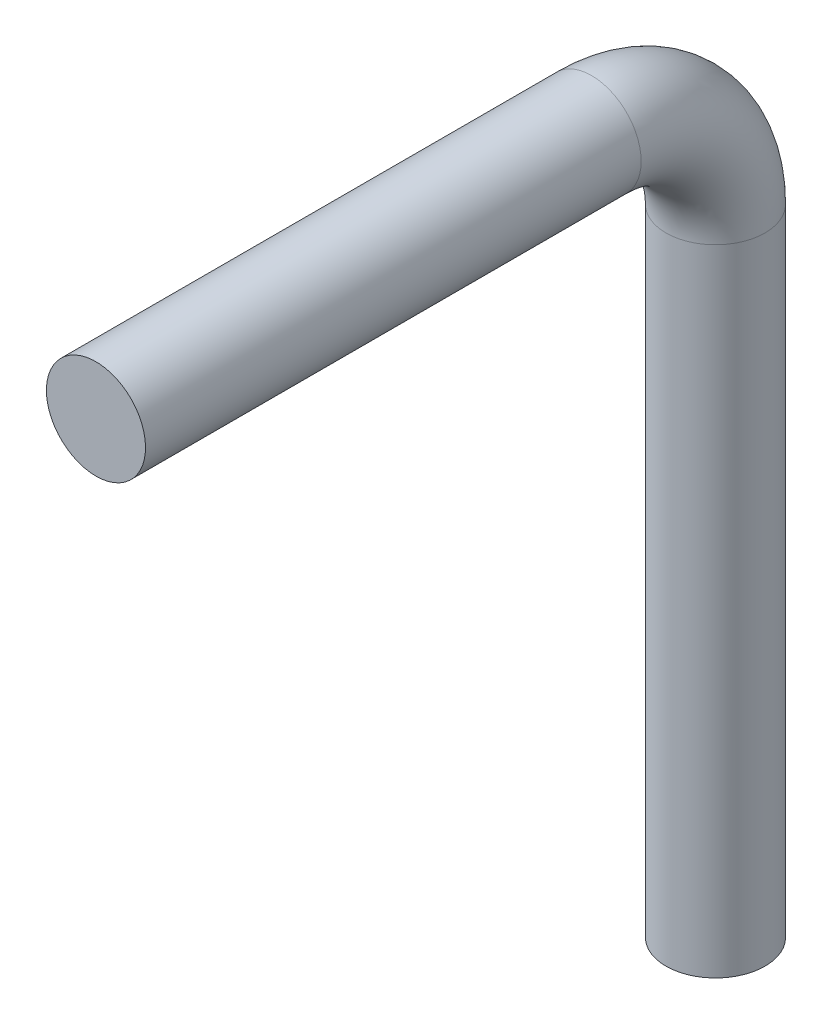
ISO-10303-21;
HEADER;
FILE_DESCRIPTION(('STEP AP214'),'2;1');
FILE_NAME('part.step','',(''),(''),'','','');
FILE_SCHEMA(('AUTOMOTIVE_DESIGN { 1 0 10303 214 1 1 1 1 }'));
ENDSEC;
DATA;
#1=APPLICATION_CONTEXT('core data for automotive mechanical design processes');
#2=APPLICATION_PROTOCOL_DEFINITION('international standard','automotive_design',2000,#1);
#3=PRODUCT_CONTEXT('',#1,'mechanical');
#4=PRODUCT('Part','Part','',(#3));
#5=PRODUCT_RELATED_PRODUCT_CATEGORY('part','',(#4));
#6=PRODUCT_DEFINITION_FORMATION('','',#4);
#7=PRODUCT_DEFINITION_CONTEXT('part definition',#1,'design');
#8=PRODUCT_DEFINITION('design','',#6,#7);
#9=PRODUCT_DEFINITION_SHAPE('','',#8);
#10=(LENGTH_UNIT() NAMED_UNIT(*) SI_UNIT(.MILLI.,.METRE.));
#11=(NAMED_UNIT(*) PLANE_ANGLE_UNIT() SI_UNIT($,.RADIAN.));
#12=(NAMED_UNIT(*) SI_UNIT($,.STERADIAN.) SOLID_ANGLE_UNIT());
#13=UNCERTAINTY_MEASURE_WITH_UNIT(LENGTH_MEASURE(1.E-05),#10,'distance_accuracy_value','');
#14=(GEOMETRIC_REPRESENTATION_CONTEXT(3) GLOBAL_UNCERTAINTY_ASSIGNED_CONTEXT((#13)) GLOBAL_UNIT_ASSIGNED_CONTEXT((#10,
#11,#12)) REPRESENTATION_CONTEXT('',''));
#15=CARTESIAN_POINT('',(0.,0.,0.));
#16=DIRECTION('',(0.,0.,1.));
#17=DIRECTION('',(1.,0.,0.));
#18=AXIS2_PLACEMENT_3D('',#15,#16,#17);
#19=CARTESIAN_POINT('',(0.,0.,0.));
#20=DIRECTION('',(0.,1.,0.));
#21=DIRECTION('',(0.,0.,1.));
#22=AXIS2_PLACEMENT_3D('',#19,#20,#21);
#23=PLANE('',#22);
#24=CARTESIAN_POINT('',(0.,0.,0.));
#25=DIRECTION('',(0.,1.,0.));
#26=DIRECTION('',(0.,0.,1.));
#27=AXIS2_PLACEMENT_3D('',#24,#25,#26);
#28=CIRCLE('',#27,5.08);
#29=CARTESIAN_POINT('',(0.,0.,5.08));
#30=VERTEX_POINT('',#29);
#31=EDGE_CURVE('E60',#30,#30,#28,.T.);
#32=ORIENTED_EDGE('',*,*,#31,.F.);
#33=EDGE_LOOP('',(#32));
#34=FACE_BOUND('',#33,.T.);
#35=ADVANCED_FACE('F43',(#34),#23,.F.);
#36=CARTESIAN_POINT('',(0.,77.7875,63.5));
#37=DIRECTION('',(0.,0.,1.));
#38=DIRECTION('',(0.,-1.,0.));
#39=AXIS2_PLACEMENT_3D('',#36,#37,#38);
#40=PLANE('',#39);
#41=CARTESIAN_POINT('',(0.,77.7875,63.5));
#42=DIRECTION('',(0.,0.,1.));
#43=DIRECTION('',(0.,-1.,0.));
#44=AXIS2_PLACEMENT_3D('',#41,#42,#43);
#45=CIRCLE('',#44,5.08);
#46=CARTESIAN_POINT('',(0.,72.7075,63.5));
#47=VERTEX_POINT('',#46);
#48=EDGE_CURVE('E10',#47,#47,#45,.T.);
#49=ORIENTED_EDGE('',*,*,#48,.T.);
#50=EDGE_LOOP('',(#49));
#51=FACE_BOUND('',#50,.T.);
#52=ADVANCED_FACE('F70',(#51),#40,.T.);
#53=CARTESIAN_POINT('',(0.,0.,0.));
#54=DIRECTION('',(0.,1.,0.));
#55=DIRECTION('',(0.,0.,1.));
#56=AXIS2_PLACEMENT_3D('',#53,#54,#55);
#57=CYLINDRICAL_SURFACE('',#56,5.08);
#58=CARTESIAN_POINT('',(0.,65.0875,0.));
#59=DIRECTION('',(0.,1.,0.));
#60=DIRECTION('',(0.,0.,1.));
#61=AXIS2_PLACEMENT_3D('',#58,#59,#60);
#62=CIRCLE('',#61,5.08);
#63=CARTESIAN_POINT('',(0.,65.0875,-5.07999999999999));
#64=VERTEX_POINT('',#63);
#65=EDGE_CURVE('E55',#64,#64,#62,.T.);
#66=ORIENTED_EDGE('',*,*,#65,.F.);
#67=EDGE_LOOP('',(#66));
#68=FACE_BOUND('',#67,.T.);
#69=ORIENTED_EDGE('',*,*,#31,.T.);
#70=EDGE_LOOP('',(#69));
#71=FACE_BOUND('',#70,.T.);
#72=ADVANCED_FACE('F67',(#68,#71),#57,.T.);
#73=CARTESIAN_POINT('',(0.,65.0875,12.7));
#74=DIRECTION('',(1.,0.,0.));
#75=DIRECTION('',(0.,0.,-1.));
#76=AXIS2_PLACEMENT_3D('',#73,#74,#75);
#77=TOROIDAL_SURFACE('',#76,12.7,5.08);
#78=CARTESIAN_POINT('',(0.,77.7875,12.7));
#79=DIRECTION('',(0.,0.,1.));
#80=DIRECTION('',(0.,-1.,0.));
#81=AXIS2_PLACEMENT_3D('',#78,#79,#80);
#82=CIRCLE('',#81,5.08);
#83=CARTESIAN_POINT('',(0.,82.8675,12.7));
#84=VERTEX_POINT('',#83);
#85=EDGE_CURVE('E50',#84,#84,#82,.T.);
#86=CARTESIAN_POINT('',(0.,65.0875,12.7));
#87=DIRECTION('',(1.,0.,0.));
#88=DIRECTION('',(0.,0.,-1.));
#89=AXIS2_PLACEMENT_3D('',#86,#87,#88);
#90=CIRCLE('',#89,17.78);
#91=EDGE_CURVE('',#64,#84,#90,.T.);
#92=ORIENTED_EDGE('',*,*,#65,.T.);
#93=ORIENTED_EDGE('',*,*,#85,.F.);
#94=ORIENTED_EDGE('',*,*,#91,.T.);
#95=ORIENTED_EDGE('',*,*,#91,.F.);
#96=EDGE_LOOP('',(#92,#94,#93,#95));
#97=FACE_BOUND('',#96,.T.);
#98=ADVANCED_FACE('F76',(#97),#77,.T.);
#99=CARTESIAN_POINT('',(0.,77.7875,12.7));
#100=DIRECTION('',(0.,0.,1.));
#101=DIRECTION('',(1.,0.,0.));
#102=AXIS2_PLACEMENT_3D('',#99,#100,#101);
#103=CYLINDRICAL_SURFACE('',#102,5.08);
#104=ORIENTED_EDGE('',*,*,#48,.F.);
#105=EDGE_LOOP('',(#104));
#106=FACE_BOUND('',#105,.T.);
#107=ORIENTED_EDGE('',*,*,#85,.T.);
#108=EDGE_LOOP('',(#107));
#109=FACE_BOUND('',#108,.T.);
#110=ADVANCED_FACE('F74',(#106,#109),#103,.T.);
#111=CLOSED_SHELL('',(#35,#52,#72,#98,#110));
#112=MANIFOLD_SOLID_BREP('B2',#111);
#113=ADVANCED_BREP_SHAPE_REPRESENTATION('',(#18,#112),#14);
#114=SHAPE_DEFINITION_REPRESENTATION(#9,#113);
ENDSEC;
END-ISO-10303-21;
